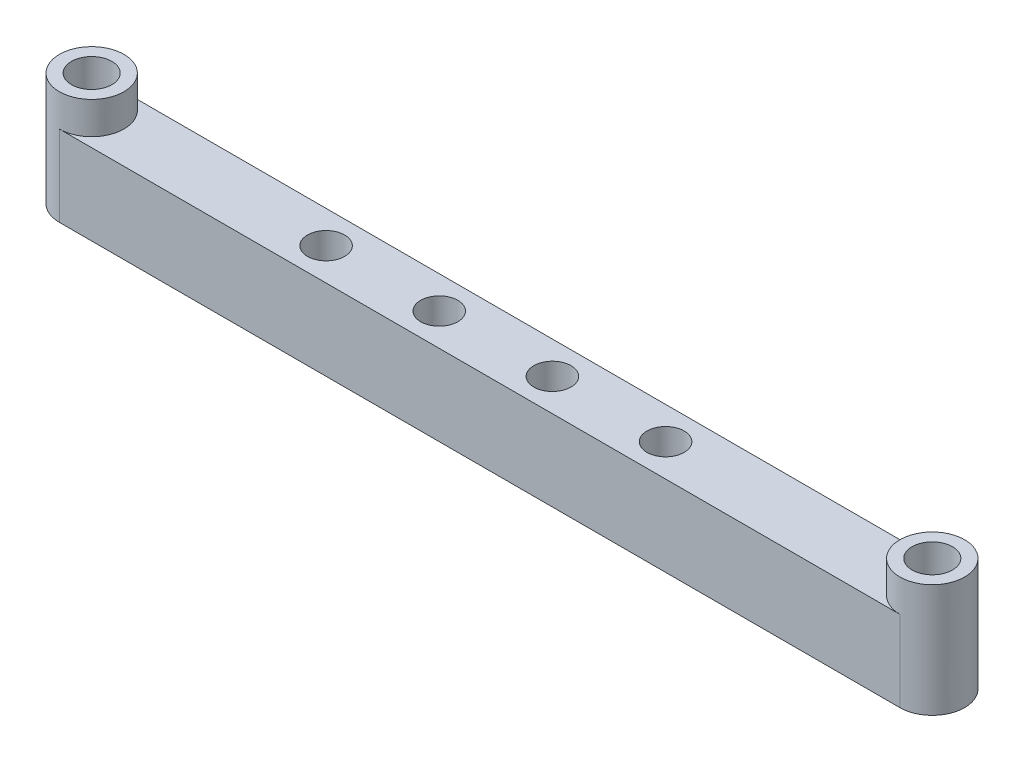
ISO-10303-21;
HEADER;
FILE_DESCRIPTION(('STEP AP214'),'2;1');
FILE_NAME('part.step','',(''),(''),'','','');
FILE_SCHEMA(('AUTOMOTIVE_DESIGN { 1 0 10303 214 1 1 1 1 }'));
ENDSEC;
DATA;
#1=APPLICATION_CONTEXT('core data for automotive mechanical design processes');
#2=APPLICATION_PROTOCOL_DEFINITION('international standard','automotive_design',2000,#1);
#3=PRODUCT_CONTEXT('',#1,'mechanical');
#4=PRODUCT('Part','Part','',(#3));
#5=PRODUCT_RELATED_PRODUCT_CATEGORY('part','',(#4));
#6=PRODUCT_DEFINITION_FORMATION('','',#4);
#7=PRODUCT_DEFINITION_CONTEXT('part definition',#1,'design');
#8=PRODUCT_DEFINITION('design','',#6,#7);
#9=PRODUCT_DEFINITION_SHAPE('','',#8);
#10=(LENGTH_UNIT() NAMED_UNIT(*) SI_UNIT(.MILLI.,.METRE.));
#11=(NAMED_UNIT(*) PLANE_ANGLE_UNIT() SI_UNIT($,.RADIAN.));
#12=(NAMED_UNIT(*) SI_UNIT($,.STERADIAN.) SOLID_ANGLE_UNIT());
#13=UNCERTAINTY_MEASURE_WITH_UNIT(LENGTH_MEASURE(1.E-05),#10,'distance_accuracy_value','');
#14=(GEOMETRIC_REPRESENTATION_CONTEXT(3) GLOBAL_UNCERTAINTY_ASSIGNED_CONTEXT((#13)) GLOBAL_UNIT_ASSIGNED_CONTEXT((#10,
#11,#12)) REPRESENTATION_CONTEXT('',''));
#15=CARTESIAN_POINT('',(0.,0.,0.));
#16=DIRECTION('',(0.,0.,1.));
#17=DIRECTION('',(1.,0.,0.));
#18=AXIS2_PLACEMENT_3D('',#15,#16,#17);
#19=CARTESIAN_POINT('',(0.,5.,0.));
#20=DIRECTION('',(0.,-1.,0.));
#21=DIRECTION('',(0.,0.,-1.));
#22=AXIS2_PLACEMENT_3D('',#19,#20,#21);
#23=PLANE('',#22);
#24=CARTESIAN_POINT('',(16.5,5.,-2.));
#25=DIRECTION('',(0.,1.,0.));
#26=DIRECTION('',(0.,0.,1.));
#27=AXIS2_PLACEMENT_3D('',#24,#25,#26);
#28=CIRCLE('',#27,1.15);
#29=CARTESIAN_POINT('',(16.5,5.,-0.850000000000001));
#30=VERTEX_POINT('',#29);
#31=EDGE_CURVE('E147',#30,#30,#28,.T.);
#32=ORIENTED_EDGE('',*,*,#31,.F.);
#33=EDGE_LOOP('',(#32));
#34=FACE_BOUND('',#33,.T.);
#35=CARTESIAN_POINT('',(23.5,5.,-2.));
#36=DIRECTION('',(0.,1.,0.));
#37=DIRECTION('',(0.,0.,1.));
#38=AXIS2_PLACEMENT_3D('',#35,#36,#37);
#39=CIRCLE('',#38,1.15);
#40=CARTESIAN_POINT('',(23.5,5.,-0.850000000000001));
#41=VERTEX_POINT('',#40);
#42=EDGE_CURVE('E141',#41,#41,#39,.T.);
#43=ORIENTED_EDGE('',*,*,#42,.F.);
#44=EDGE_LOOP('',(#43));
#45=FACE_BOUND('',#44,.T.);
#46=CARTESIAN_POINT('',(30.5,5.,-2.));
#47=DIRECTION('',(0.,1.,0.));
#48=DIRECTION('',(0.,0.,-1.));
#49=AXIS2_PLACEMENT_3D('',#46,#47,#48);
#50=CIRCLE('',#49,1.15);
#51=CARTESIAN_POINT('',(30.5,5.,-3.15));
#52=VERTEX_POINT('',#51);
#53=EDGE_CURVE('E132',#52,#52,#50,.T.);
#54=ORIENTED_EDGE('',*,*,#53,.F.);
#55=EDGE_LOOP('',(#54));
#56=FACE_BOUND('',#55,.T.);
#57=CARTESIAN_POINT('',(37.5,5.,-2.));
#58=DIRECTION('',(0.,1.,0.));
#59=DIRECTION('',(0.,0.,-1.));
#60=AXIS2_PLACEMENT_3D('',#57,#58,#59);
#61=CIRCLE('',#60,1.15);
#62=CARTESIAN_POINT('',(37.5,5.,-3.15));
#63=VERTEX_POINT('',#62);
#64=EDGE_CURVE('E125',#63,#63,#61,.T.);
#65=ORIENTED_EDGE('',*,*,#64,.F.);
#66=EDGE_LOOP('',(#65));
#67=FACE_BOUND('',#66,.T.);
#68=CARTESIAN_POINT('',(54.,5.,-2.));
#69=DIRECTION('',(0.,1.,0.));
#70=DIRECTION('',(0.,0.,1.));
#71=AXIS2_PLACEMENT_3D('',#68,#69,#70);
#72=CIRCLE('',#71,2.);
#73=CARTESIAN_POINT('',(54.,5.,-4.));
#74=VERTEX_POINT('',#73);
#75=CARTESIAN_POINT('',(54.,5.,0.));
#76=VERTEX_POINT('',#75);
#77=EDGE_CURVE('E92',#74,#76,#72,.T.);
#78=ORIENTED_EDGE('',*,*,#77,.F.);
#79=DIRECTION('',(-1.,0.,0.));
#80=VECTOR('',#79,1.);
#81=CARTESIAN_POINT('',(0.,5.,-4.));
#82=LINE('',#81,#80);
#83=CARTESIAN_POINT('',(2.,5.,-4.));
#84=VERTEX_POINT('',#83);
#85=EDGE_CURVE('E101',#74,#84,#82,.T.);
#86=ORIENTED_EDGE('',*,*,#85,.T.);
#87=CARTESIAN_POINT('',(2.,5.,-2.));
#88=DIRECTION('',(0.,1.,0.));
#89=DIRECTION('',(0.,0.,1.));
#90=AXIS2_PLACEMENT_3D('',#87,#88,#89);
#91=CIRCLE('',#90,2.);
#92=CARTESIAN_POINT('',(2.,5.,0.));
#93=VERTEX_POINT('',#92);
#94=EDGE_CURVE('E120',#93,#84,#91,.T.);
#95=ORIENTED_EDGE('',*,*,#94,.F.);
#96=DIRECTION('',(1.,0.,0.));
#97=VECTOR('',#96,1.);
#98=CARTESIAN_POINT('',(0.,5.,0.));
#99=LINE('',#98,#97);
#100=EDGE_CURVE('E107',#93,#76,#99,.T.);
#101=ORIENTED_EDGE('',*,*,#100,.T.);
#102=EDGE_LOOP('',(#78,#86,#95,#101));
#103=FACE_BOUND('',#102,.T.);
#104=ADVANCED_FACE('F33',(#34,#45,#56,#67,#103),#23,.F.);
#105=CARTESIAN_POINT('',(0.,0.,0.));
#106=DIRECTION('',(0.,-1.,0.));
#107=DIRECTION('',(0.,0.,-1.));
#108=AXIS2_PLACEMENT_3D('',#105,#106,#107);
#109=PLANE('',#108);
#110=CARTESIAN_POINT('',(30.5,0.,-2.));
#111=DIRECTION('',(0.,1.,0.));
#112=DIRECTION('',(0.,0.,-1.));
#113=AXIS2_PLACEMENT_3D('',#110,#111,#112);
#114=CIRCLE('',#113,1.15);
#115=CARTESIAN_POINT('',(30.5,0.,-3.15));
#116=VERTEX_POINT('',#115);
#117=EDGE_CURVE('E128',#116,#116,#114,.T.);
#118=ORIENTED_EDGE('',*,*,#117,.T.);
#119=EDGE_LOOP('',(#118));
#120=FACE_BOUND('',#119,.T.);
#121=CARTESIAN_POINT('',(23.5,0.,-2.));
#122=DIRECTION('',(0.,1.,0.));
#123=DIRECTION('',(0.,0.,1.));
#124=AXIS2_PLACEMENT_3D('',#121,#122,#123);
#125=CIRCLE('',#124,1.15);
#126=CARTESIAN_POINT('',(23.5,0.,-0.850000000000001));
#127=VERTEX_POINT('',#126);
#128=EDGE_CURVE('E140',#127,#127,#125,.T.);
#129=ORIENTED_EDGE('',*,*,#128,.T.);
#130=EDGE_LOOP('',(#129));
#131=FACE_BOUND('',#130,.T.);
#132=CARTESIAN_POINT('',(2.,0.,-2.));
#133=DIRECTION('',(0.,1.,0.));
#134=DIRECTION('',(0.,0.,1.));
#135=AXIS2_PLACEMENT_3D('',#132,#133,#134);
#136=CIRCLE('',#135,1.25);
#137=CARTESIAN_POINT('',(2.,0.,-0.75));
#138=VERTEX_POINT('',#137);
#139=EDGE_CURVE('E150',#138,#138,#136,.T.);
#140=ORIENTED_EDGE('',*,*,#139,.T.);
#141=EDGE_LOOP('',(#140));
#142=FACE_BOUND('',#141,.T.);
#143=DIRECTION('',(-1.,0.,0.));
#144=VECTOR('',#143,1.);
#145=CARTESIAN_POINT('',(0.,0.,-4.));
#146=LINE('',#145,#144);
#147=CARTESIAN_POINT('',(54.,0.,-4.));
#148=VERTEX_POINT('',#147);
#149=CARTESIAN_POINT('',(2.,0.,-4.));
#150=VERTEX_POINT('',#149);
#151=EDGE_CURVE('E156',#148,#150,#146,.T.);
#152=ORIENTED_EDGE('',*,*,#151,.F.);
#153=CARTESIAN_POINT('',(54.,0.,-2.));
#154=DIRECTION('',(0.,-1.,0.));
#155=DIRECTION('',(0.,0.,-1.));
#156=AXIS2_PLACEMENT_3D('',#153,#154,#155);
#157=CIRCLE('',#156,2.);
#158=CARTESIAN_POINT('',(56.,0.,-2.));
#159=VERTEX_POINT('',#158);
#160=EDGE_CURVE('E93',#148,#159,#157,.T.);
#161=ORIENTED_EDGE('',*,*,#160,.T.);
#162=CARTESIAN_POINT('',(54.,0.,-2.));
#163=DIRECTION('',(0.,-1.,0.));
#164=DIRECTION('',(0.,0.,-1.));
#165=AXIS2_PLACEMENT_3D('',#162,#163,#164);
#166=CIRCLE('',#165,2.);
#167=CARTESIAN_POINT('',(54.,0.,0.));
#168=VERTEX_POINT('',#167);
#169=EDGE_CURVE('E164',#159,#168,#166,.T.);
#170=ORIENTED_EDGE('',*,*,#169,.T.);
#171=DIRECTION('',(1.,0.,0.));
#172=VECTOR('',#171,1.);
#173=CARTESIAN_POINT('',(0.,0.,0.));
#174=LINE('',#173,#172);
#175=CARTESIAN_POINT('',(2.,0.,0.));
#176=VERTEX_POINT('',#175);
#177=EDGE_CURVE('E155',#176,#168,#174,.T.);
#178=ORIENTED_EDGE('',*,*,#177,.F.);
#179=CARTESIAN_POINT('',(2.,0.,-2.));
#180=DIRECTION('',(0.,-1.,0.));
#181=DIRECTION('',(0.,0.,-1.));
#182=AXIS2_PLACEMENT_3D('',#179,#180,#181);
#183=CIRCLE('',#182,2.);
#184=CARTESIAN_POINT('',(0.,0.,-2.));
#185=VERTEX_POINT('',#184);
#186=EDGE_CURVE('E97',#176,#185,#183,.T.);
#187=ORIENTED_EDGE('',*,*,#186,.T.);
#188=CARTESIAN_POINT('',(2.,0.,-2.));
#189=DIRECTION('',(0.,-1.,0.));
#190=DIRECTION('',(0.,0.,-1.));
#191=AXIS2_PLACEMENT_3D('',#188,#189,#190);
#192=CIRCLE('',#191,2.);
#193=EDGE_CURVE('E162',#185,#150,#192,.T.);
#194=ORIENTED_EDGE('',*,*,#193,.T.);
#195=EDGE_LOOP('',(#152,#161,#170,#178,#187,#194));
#196=FACE_BOUND('',#195,.T.);
#197=CARTESIAN_POINT('',(16.5,0.,-2.));
#198=DIRECTION('',(0.,1.,0.));
#199=DIRECTION('',(0.,0.,1.));
#200=AXIS2_PLACEMENT_3D('',#197,#198,#199);
#201=CIRCLE('',#200,1.15);
#202=CARTESIAN_POINT('',(16.5,0.,-0.850000000000001));
#203=VERTEX_POINT('',#202);
#204=EDGE_CURVE('E144',#203,#203,#201,.T.);
#205=ORIENTED_EDGE('',*,*,#204,.T.);
#206=EDGE_LOOP('',(#205));
#207=FACE_BOUND('',#206,.T.);
#208=CARTESIAN_POINT('',(54.,0.,-2.));
#209=DIRECTION('',(0.,1.,0.));
#210=DIRECTION('',(0.,0.,-1.));
#211=AXIS2_PLACEMENT_3D('',#208,#209,#210);
#212=CIRCLE('',#211,1.25);
#213=CARTESIAN_POINT('',(54.,0.,-3.25));
#214=VERTEX_POINT('',#213);
#215=EDGE_CURVE('E135',#214,#214,#212,.T.);
#216=ORIENTED_EDGE('',*,*,#215,.T.);
#217=EDGE_LOOP('',(#216));
#218=FACE_BOUND('',#217,.T.);
#219=CARTESIAN_POINT('',(37.5,0.,-2.));
#220=DIRECTION('',(0.,1.,0.));
#221=DIRECTION('',(0.,0.,-1.));
#222=AXIS2_PLACEMENT_3D('',#219,#220,#221);
#223=CIRCLE('',#222,1.15);
#224=CARTESIAN_POINT('',(37.5,0.,-3.15));
#225=VERTEX_POINT('',#224);
#226=EDGE_CURVE('E129',#225,#225,#223,.T.);
#227=ORIENTED_EDGE('',*,*,#226,.T.);
#228=EDGE_LOOP('',(#227));
#229=FACE_BOUND('',#228,.T.);
#230=ADVANCED_FACE('F173',(#120,#131,#142,#196,#207,#218,#229),#109,.T.);
#231=CARTESIAN_POINT('',(0.,5.,0.));
#232=DIRECTION('',(0.,0.,-1.));
#233=DIRECTION('',(-1.,0.,0.));
#234=AXIS2_PLACEMENT_3D('',#231,#232,#233);
#235=PLANE('',#234);
#236=ORIENTED_EDGE('',*,*,#177,.T.);
#237=DIRECTION('',(0.,-1.,0.));
#238=VECTOR('',#237,1.);
#239=CARTESIAN_POINT('',(54.,5.,0.));
#240=LINE('',#239,#238);
#241=EDGE_CURVE('E11',#168,#76,#240,.F.);
#242=ORIENTED_EDGE('',*,*,#241,.T.);
#243=ORIENTED_EDGE('',*,*,#100,.F.);
#244=DIRECTION('',(0.,-1.,0.));
#245=VECTOR('',#244,1.);
#246=CARTESIAN_POINT('',(2.,5.,0.));
#247=LINE('',#246,#245);
#248=EDGE_CURVE('E42',#93,#176,#247,.T.);
#249=ORIENTED_EDGE('',*,*,#248,.T.);
#250=EDGE_LOOP('',(#236,#242,#243,#249));
#251=FACE_BOUND('',#250,.T.);
#252=ADVANCED_FACE('F176',(#251),#235,.F.);
#253=CARTESIAN_POINT('',(0.,5.,-4.));
#254=DIRECTION('',(0.,0.,1.));
#255=DIRECTION('',(1.,0.,0.));
#256=AXIS2_PLACEMENT_3D('',#253,#254,#255);
#257=PLANE('',#256);
#258=ORIENTED_EDGE('',*,*,#85,.F.);
#259=DIRECTION('',(0.,-1.,0.));
#260=VECTOR('',#259,1.);
#261=CARTESIAN_POINT('',(54.,5.,-4.));
#262=LINE('',#261,#260);
#263=EDGE_CURVE('E87',#74,#148,#262,.T.);
#264=ORIENTED_EDGE('',*,*,#263,.T.);
#265=ORIENTED_EDGE('',*,*,#151,.T.);
#266=DIRECTION('',(0.,-1.,0.));
#267=VECTOR('',#266,1.);
#268=CARTESIAN_POINT('',(2.,5.,-4.));
#269=LINE('',#268,#267);
#270=EDGE_CURVE('E98',#150,#84,#269,.F.);
#271=ORIENTED_EDGE('',*,*,#270,.T.);
#272=EDGE_LOOP('',(#258,#264,#265,#271));
#273=FACE_BOUND('',#272,.T.);
#274=ADVANCED_FACE('F102',(#273),#257,.F.);
#275=CARTESIAN_POINT('',(2.,5.,-2.));
#276=DIRECTION('',(0.,-1.,0.));
#277=DIRECTION('',(0.,0.,-1.));
#278=AXIS2_PLACEMENT_3D('',#275,#276,#277);
#279=CYLINDRICAL_SURFACE('',#278,1.25);
#280=ORIENTED_EDGE('',*,*,#139,.F.);
#281=EDGE_LOOP('',(#280));
#282=FACE_BOUND('',#281,.T.);
#283=CARTESIAN_POINT('',(2.,7.,-2.));
#284=DIRECTION('',(0.,1.,0.));
#285=DIRECTION('',(0.,0.,1.));
#286=AXIS2_PLACEMENT_3D('',#283,#284,#285);
#287=CIRCLE('',#286,1.25);
#288=CARTESIAN_POINT('',(2.,7.,-0.749999999999999));
#289=VERTEX_POINT('',#288);
#290=EDGE_CURVE('E113',#289,#289,#287,.T.);
#291=ORIENTED_EDGE('',*,*,#290,.T.);
#292=EDGE_LOOP('',(#291));
#293=FACE_BOUND('',#292,.T.);
#294=ADVANCED_FACE('F183',(#282,#293),#279,.F.);
#295=CARTESIAN_POINT('',(16.5,5.,-2.));
#296=DIRECTION('',(0.,-1.,0.));
#297=DIRECTION('',(0.,0.,-1.));
#298=AXIS2_PLACEMENT_3D('',#295,#296,#297);
#299=CYLINDRICAL_SURFACE('',#298,1.15);
#300=ORIENTED_EDGE('',*,*,#31,.T.);
#301=EDGE_LOOP('',(#300));
#302=FACE_BOUND('',#301,.T.);
#303=ORIENTED_EDGE('',*,*,#204,.F.);
#304=EDGE_LOOP('',(#303));
#305=FACE_BOUND('',#304,.T.);
#306=ADVANCED_FACE('F197',(#302,#305),#299,.F.);
#307=CARTESIAN_POINT('',(23.5,5.,-2.));
#308=DIRECTION('',(0.,-1.,0.));
#309=DIRECTION('',(0.,0.,-1.));
#310=AXIS2_PLACEMENT_3D('',#307,#308,#309);
#311=CYLINDRICAL_SURFACE('',#310,1.15);
#312=ORIENTED_EDGE('',*,*,#42,.T.);
#313=EDGE_LOOP('',(#312));
#314=FACE_BOUND('',#313,.T.);
#315=ORIENTED_EDGE('',*,*,#128,.F.);
#316=EDGE_LOOP('',(#315));
#317=FACE_BOUND('',#316,.T.);
#318=ADVANCED_FACE('F201',(#314,#317),#311,.F.);
#319=CARTESIAN_POINT('',(54.,5.,-2.));
#320=DIRECTION('',(0.,-1.,0.));
#321=DIRECTION('',(0.,0.,-1.));
#322=AXIS2_PLACEMENT_3D('',#319,#320,#321);
#323=CYLINDRICAL_SURFACE('',#322,1.25);
#324=ORIENTED_EDGE('',*,*,#215,.F.);
#325=EDGE_LOOP('',(#324));
#326=FACE_BOUND('',#325,.T.);
#327=CARTESIAN_POINT('',(54.,7.,-2.));
#328=DIRECTION('',(0.,1.,0.));
#329=DIRECTION('',(0.,0.,1.));
#330=AXIS2_PLACEMENT_3D('',#327,#328,#329);
#331=CIRCLE('',#330,1.25);
#332=CARTESIAN_POINT('',(54.,7.,-0.749999999999995));
#333=VERTEX_POINT('',#332);
#334=EDGE_CURVE('E110',#333,#333,#331,.T.);
#335=ORIENTED_EDGE('',*,*,#334,.T.);
#336=EDGE_LOOP('',(#335));
#337=FACE_BOUND('',#336,.T.);
#338=ADVANCED_FACE('F205',(#326,#337),#323,.F.);
#339=CARTESIAN_POINT('',(30.5,5.,-2.));
#340=DIRECTION('',(0.,-1.,0.));
#341=DIRECTION('',(0.,0.,-1.));
#342=AXIS2_PLACEMENT_3D('',#339,#340,#341);
#343=CYLINDRICAL_SURFACE('',#342,1.15);
#344=ORIENTED_EDGE('',*,*,#53,.T.);
#345=EDGE_LOOP('',(#344));
#346=FACE_BOUND('',#345,.T.);
#347=ORIENTED_EDGE('',*,*,#117,.F.);
#348=EDGE_LOOP('',(#347));
#349=FACE_BOUND('',#348,.T.);
#350=ADVANCED_FACE('F209',(#346,#349),#343,.F.);
#351=CARTESIAN_POINT('',(37.5,5.,-2.));
#352=DIRECTION('',(0.,-1.,0.));
#353=DIRECTION('',(0.,0.,-1.));
#354=AXIS2_PLACEMENT_3D('',#351,#352,#353);
#355=CYLINDRICAL_SURFACE('',#354,1.15);
#356=ORIENTED_EDGE('',*,*,#64,.T.);
#357=EDGE_LOOP('',(#356));
#358=FACE_BOUND('',#357,.T.);
#359=ORIENTED_EDGE('',*,*,#226,.F.);
#360=EDGE_LOOP('',(#359));
#361=FACE_BOUND('',#360,.T.);
#362=ADVANCED_FACE('F213',(#358,#361),#355,.F.);
#363=CARTESIAN_POINT('',(54.,5.,-2.));
#364=DIRECTION('',(0.,-1.,0.));
#365=DIRECTION('',(0.,0.,-1.));
#366=AXIS2_PLACEMENT_3D('',#363,#364,#365);
#367=CYLINDRICAL_SURFACE('',#366,2.);
#368=DIRECTION('',(0.,-1.,0.));
#369=VECTOR('',#368,1.);
#370=CARTESIAN_POINT('',(56.,5.,-2.));
#371=LINE('',#370,#369);
#372=CARTESIAN_POINT('',(56.,5.,-2.));
#373=VERTEX_POINT('',#372);
#374=EDGE_CURVE('E49',#373,#159,#371,.T.);
#375=ORIENTED_EDGE('',*,*,#374,.F.);
#376=ORIENTED_EDGE('',*,*,#374,.T.);
#377=ORIENTED_EDGE('',*,*,#160,.F.);
#378=ORIENTED_EDGE('',*,*,#263,.F.);
#379=ORIENTED_EDGE('',*,*,#77,.T.);
#380=ORIENTED_EDGE('',*,*,#241,.F.);
#381=ORIENTED_EDGE('',*,*,#169,.F.);
#382=EDGE_LOOP('',(#375,#376,#377,#378,#379,#380,#381));
#383=FACE_BOUND('',#382,.T.);
#384=CARTESIAN_POINT('',(54.,7.,-2.));
#385=DIRECTION('',(0.,1.,0.));
#386=DIRECTION('',(0.,0.,1.));
#387=AXIS2_PLACEMENT_3D('',#384,#385,#386);
#388=CIRCLE('',#387,2.);
#389=CARTESIAN_POINT('',(54.,7.,0.));
#390=VERTEX_POINT('',#389);
#391=EDGE_CURVE('E109',#390,#390,#388,.T.);
#392=ORIENTED_EDGE('',*,*,#391,.F.);
#393=EDGE_LOOP('',(#392));
#394=FACE_BOUND('',#393,.T.);
#395=ADVANCED_FACE('F89',(#383,#394),#367,.T.);
#396=CARTESIAN_POINT('',(2.,5.,-2.));
#397=DIRECTION('',(0.,-1.,0.));
#398=DIRECTION('',(0.,0.,-1.));
#399=AXIS2_PLACEMENT_3D('',#396,#397,#398);
#400=CYLINDRICAL_SURFACE('',#399,2.);
#401=ORIENTED_EDGE('',*,*,#248,.F.);
#402=ORIENTED_EDGE('',*,*,#94,.T.);
#403=ORIENTED_EDGE('',*,*,#270,.F.);
#404=ORIENTED_EDGE('',*,*,#193,.F.);
#405=DIRECTION('',(0.,-1.,0.));
#406=VECTOR('',#405,1.);
#407=CARTESIAN_POINT('',(0.,5.,-2.));
#408=LINE('',#407,#406);
#409=CARTESIAN_POINT('',(0.,5.,-2.));
#410=VERTEX_POINT('',#409);
#411=EDGE_CURVE('E37',#185,#410,#408,.F.);
#412=ORIENTED_EDGE('',*,*,#411,.T.);
#413=ORIENTED_EDGE('',*,*,#411,.F.);
#414=ORIENTED_EDGE('',*,*,#186,.F.);
#415=EDGE_LOOP('',(#401,#402,#403,#404,#412,#413,#414));
#416=FACE_BOUND('',#415,.T.);
#417=CARTESIAN_POINT('',(2.,7.,-2.));
#418=DIRECTION('',(0.,1.,0.));
#419=DIRECTION('',(0.,0.,1.));
#420=AXIS2_PLACEMENT_3D('',#417,#418,#419);
#421=CIRCLE('',#420,2.);
#422=CARTESIAN_POINT('',(2.,7.,0.));
#423=VERTEX_POINT('',#422);
#424=EDGE_CURVE('E121',#423,#423,#421,.T.);
#425=ORIENTED_EDGE('',*,*,#424,.F.);
#426=EDGE_LOOP('',(#425));
#427=FACE_BOUND('',#426,.T.);
#428=ADVANCED_FACE('F35',(#416,#427),#400,.T.);
#429=CARTESIAN_POINT('',(2.,7.,-2.));
#430=DIRECTION('',(0.,1.,0.));
#431=DIRECTION('',(0.,0.,1.));
#432=AXIS2_PLACEMENT_3D('',#429,#430,#431);
#433=PLANE('',#432);
#434=ORIENTED_EDGE('',*,*,#424,.T.);
#435=EDGE_LOOP('',(#434));
#436=FACE_BOUND('',#435,.T.);
#437=ORIENTED_EDGE('',*,*,#290,.F.);
#438=EDGE_LOOP('',(#437));
#439=FACE_BOUND('',#438,.T.);
#440=ADVANCED_FACE('F218',(#436,#439),#433,.T.);
#441=CARTESIAN_POINT('',(54.,7.,-2.));
#442=DIRECTION('',(0.,1.,0.));
#443=DIRECTION('',(0.,0.,1.));
#444=AXIS2_PLACEMENT_3D('',#441,#442,#443);
#445=PLANE('',#444);
#446=ORIENTED_EDGE('',*,*,#391,.T.);
#447=EDGE_LOOP('',(#446));
#448=FACE_BOUND('',#447,.T.);
#449=ORIENTED_EDGE('',*,*,#334,.F.);
#450=EDGE_LOOP('',(#449));
#451=FACE_BOUND('',#450,.T.);
#452=ADVANCED_FACE('F221',(#448,#451),#445,.T.);
#453=CLOSED_SHELL('',(#104,#230,#252,#274,#294,#306,#318,#338,#350,#362,#395,#428,#440,#452));
#454=MANIFOLD_SOLID_BREP('B2',#453);
#455=ADVANCED_BREP_SHAPE_REPRESENTATION('',(#18,#454),#14);
#456=SHAPE_DEFINITION_REPRESENTATION(#9,#455);
ENDSEC;
END-ISO-10303-21;
